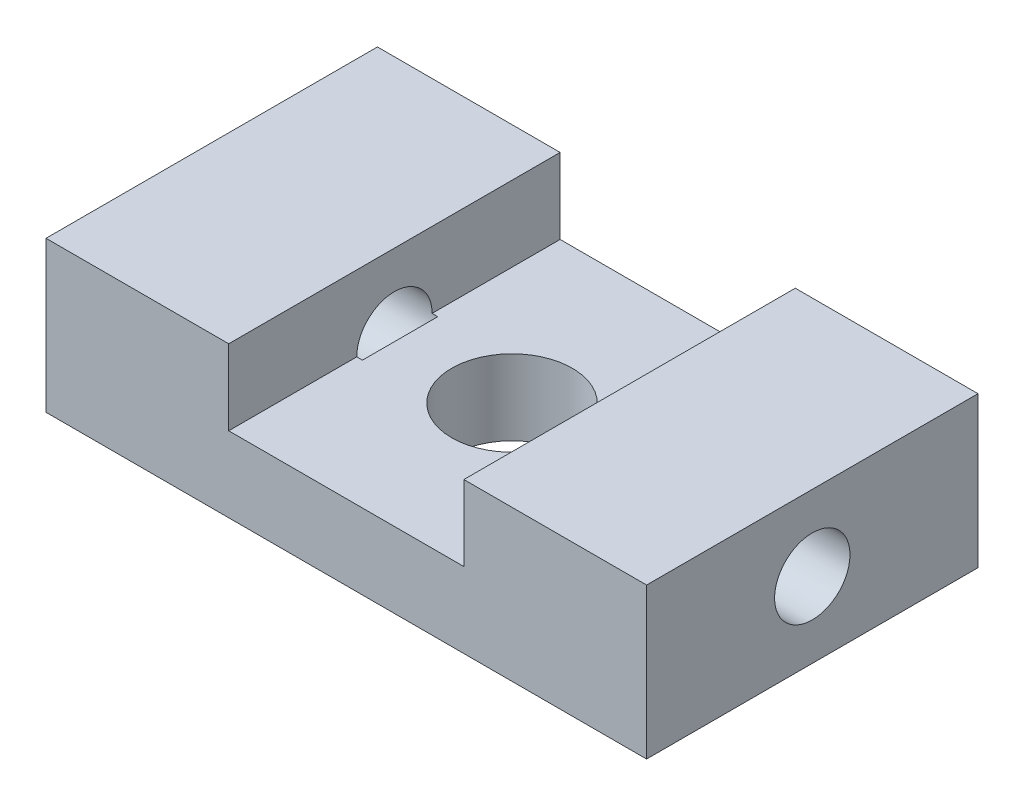
ISO-10303-21;
HEADER;
FILE_DESCRIPTION(('STEP AP214'),'2;1');
FILE_NAME('part.step','',(''),(''),'','','');
FILE_SCHEMA(('AUTOMOTIVE_DESIGN { 1 0 10303 214 1 1 1 1 }'));
ENDSEC;
DATA;
#1=APPLICATION_CONTEXT('core data for automotive mechanical design processes');
#2=APPLICATION_PROTOCOL_DEFINITION('international standard','automotive_design',2000,#1);
#3=PRODUCT_CONTEXT('',#1,'mechanical');
#4=PRODUCT('Part','Part','',(#3));
#5=PRODUCT_RELATED_PRODUCT_CATEGORY('part','',(#4));
#6=PRODUCT_DEFINITION_FORMATION('','',#4);
#7=PRODUCT_DEFINITION_CONTEXT('part definition',#1,'design');
#8=PRODUCT_DEFINITION('design','',#6,#7);
#9=PRODUCT_DEFINITION_SHAPE('','',#8);
#10=(LENGTH_UNIT() NAMED_UNIT(*) SI_UNIT(.MILLI.,.METRE.));
#11=(NAMED_UNIT(*) PLANE_ANGLE_UNIT() SI_UNIT($,.RADIAN.));
#12=(NAMED_UNIT(*) SI_UNIT($,.STERADIAN.) SOLID_ANGLE_UNIT());
#13=UNCERTAINTY_MEASURE_WITH_UNIT(LENGTH_MEASURE(1.E-05),#10,'distance_accuracy_value','');
#14=(GEOMETRIC_REPRESENTATION_CONTEXT(3) GLOBAL_UNCERTAINTY_ASSIGNED_CONTEXT((#13)) GLOBAL_UNIT_ASSIGNED_CONTEXT((#10,
#11,#12)) REPRESENTATION_CONTEXT('',''));
#15=CARTESIAN_POINT('',(0.,0.,0.));
#16=DIRECTION('',(0.,0.,1.));
#17=DIRECTION('',(1.,0.,0.));
#18=AXIS2_PLACEMENT_3D('',#15,#16,#17);
#19=CARTESIAN_POINT('',(39.8443423513475,20.,21.9869694383377));
#20=DIRECTION('',(0.,1.,0.));
#21=DIRECTION('',(0.,0.,1.));
#22=AXIS2_PLACEMENT_3D('',#19,#20,#21);
#23=PLANE('',#22);
#24=DIRECTION('',(0.,0.,-1.));
#25=VECTOR('',#24,1.);
#26=CARTESIAN_POINT('',(15.6,20.,-25.));
#27=LINE('',#26,#25);
#28=CARTESIAN_POINT('',(15.6,20.,21.9869694383377));
#29=VERTEX_POINT('',#28);
#30=CARTESIAN_POINT('',(15.6,20.,-21.9869694383377));
#31=VERTEX_POINT('',#30);
#32=EDGE_CURVE('E260',#29,#31,#27,.T.);
#33=ORIENTED_EDGE('',*,*,#32,.F.);
#34=DIRECTION('',(1.,0.,0.));
#35=VECTOR('',#34,1.);
#36=CARTESIAN_POINT('',(-39.8443423513475,20.,21.9869694383377));
#37=LINE('',#36,#35);
#38=CARTESIAN_POINT('',(39.8443423513475,20.,21.9869694383377));
#39=VERTEX_POINT('',#38);
#40=EDGE_CURVE('E141',#29,#39,#37,.T.);
#41=ORIENTED_EDGE('',*,*,#40,.T.);
#42=DIRECTION('',(0.,0.,-1.));
#43=VECTOR('',#42,1.);
#44=CARTESIAN_POINT('',(39.8443423513475,20.,-21.9869694383377));
#45=LINE('',#44,#43);
#46=CARTESIAN_POINT('',(39.8443423513475,20.,-21.9869694383377));
#47=VERTEX_POINT('',#46);
#48=EDGE_CURVE('E169',#39,#47,#45,.T.);
#49=ORIENTED_EDGE('',*,*,#48,.T.);
#50=DIRECTION('',(-1.,0.,0.));
#51=VECTOR('',#50,1.);
#52=CARTESIAN_POINT('',(-39.8443423513475,20.,-21.9869694383377));
#53=LINE('',#52,#51);
#54=EDGE_CURVE('E174',#47,#31,#53,.T.);
#55=ORIENTED_EDGE('',*,*,#54,.T.);
#56=EDGE_LOOP('',(#33,#41,#49,#55));
#57=FACE_BOUND('',#56,.T.);
#58=ADVANCED_FACE('F31',(#57),#23,.T.);
#59=CARTESIAN_POINT('',(0.,20.,0.));
#60=DIRECTION('',(0.,-1.,0.));
#61=DIRECTION('',(0.,0.,-1.));
#62=AXIS2_PLACEMENT_3D('',#59,#60,#61);
#63=CYLINDRICAL_SURFACE('',#62,8.);
#64=CARTESIAN_POINT('',(0.,0.,0.));
#65=DIRECTION('',(0.,1.,0.));
#66=DIRECTION('',(0.,0.,1.));
#67=AXIS2_PLACEMENT_3D('',#64,#65,#66);
#68=CIRCLE('',#67,8.);
#69=CARTESIAN_POINT('',(0.,0.,8.00000000000001));
#70=VERTEX_POINT('',#69);
#71=EDGE_CURVE('E163',#70,#70,#68,.T.);
#72=ORIENTED_EDGE('',*,*,#71,.F.);
#73=EDGE_LOOP('',(#72));
#74=FACE_BOUND('',#73,.T.);
#75=CARTESIAN_POINT('',(0.,10.,0.));
#76=DIRECTION('',(0.,1.,0.));
#77=DIRECTION('',(0.,0.,1.));
#78=AXIS2_PLACEMENT_3D('',#75,#76,#77);
#79=CIRCLE('',#78,8.);
#80=CARTESIAN_POINT('',(0.,10.,8.00000000000001));
#81=VERTEX_POINT('',#80);
#82=EDGE_CURVE('E128',#81,#81,#79,.T.);
#83=ORIENTED_EDGE('',*,*,#82,.T.);
#84=EDGE_LOOP('',(#83));
#85=FACE_BOUND('',#84,.T.);
#86=ADVANCED_FACE('F222',(#74,#85),#63,.F.);
#87=CARTESIAN_POINT('',(-14.8443423513475,10.,0.));
#88=DIRECTION('',(-1.,0.,0.));
#89=DIRECTION('',(0.,0.,1.));
#90=AXIS2_PLACEMENT_3D('',#87,#88,#89);
#91=CYLINDRICAL_SURFACE('',#90,5.);
#92=CARTESIAN_POINT('',(-39.8443423513475,10.,0.));
#93=DIRECTION('',(-1.,0.,0.));
#94=DIRECTION('',(0.,0.,1.));
#95=AXIS2_PLACEMENT_3D('',#92,#93,#94);
#96=CIRCLE('',#95,5.);
#97=CARTESIAN_POINT('',(-39.8443423513475,10.,5.));
#98=VERTEX_POINT('',#97);
#99=EDGE_CURVE('E157',#98,#98,#96,.T.);
#100=ORIENTED_EDGE('',*,*,#99,.T.);
#101=EDGE_LOOP('',(#100));
#102=FACE_BOUND('',#101,.T.);
#103=DIRECTION('',(-1.,0.,0.));
#104=VECTOR('',#103,1.);
#105=CARTESIAN_POINT('',(-14.8443423513475,10.,-5.));
#106=LINE('',#105,#104);
#107=CARTESIAN_POINT('',(-15.6,10.,-5.));
#108=VERTEX_POINT('',#107);
#109=CARTESIAN_POINT('',(-14.8443423513475,10.,-5.));
#110=VERTEX_POINT('',#109);
#111=EDGE_CURVE('E53',#108,#110,#106,.F.);
#112=ORIENTED_EDGE('',*,*,#111,.F.);
#113=CARTESIAN_POINT('',(-15.6,10.,0.));
#114=DIRECTION('',(-1.,0.,0.));
#115=DIRECTION('',(0.,0.,1.));
#116=AXIS2_PLACEMENT_3D('',#113,#114,#115);
#117=CIRCLE('',#116,5.);
#118=CARTESIAN_POINT('',(-15.6,10.,5.));
#119=VERTEX_POINT('',#118);
#120=EDGE_CURVE('E11',#108,#119,#117,.F.);
#121=ORIENTED_EDGE('',*,*,#120,.T.);
#122=DIRECTION('',(-1.,0.,0.));
#123=VECTOR('',#122,1.);
#124=CARTESIAN_POINT('',(-14.8443423513475,10.,5.));
#125=LINE('',#124,#123);
#126=CARTESIAN_POINT('',(-14.8443423513475,10.,5.));
#127=VERTEX_POINT('',#126);
#128=EDGE_CURVE('E211',#127,#119,#125,.T.);
#129=ORIENTED_EDGE('',*,*,#128,.F.);
#130=CARTESIAN_POINT('',(-14.8443423513475,10.,0.));
#131=DIRECTION('',(-1.,0.,0.));
#132=DIRECTION('',(0.,0.,1.));
#133=AXIS2_PLACEMENT_3D('',#130,#131,#132);
#134=CIRCLE('',#133,5.);
#135=EDGE_CURVE('E160',#110,#127,#134,.T.);
#136=ORIENTED_EDGE('',*,*,#135,.F.);
#137=EDGE_LOOP('',(#112,#121,#129,#136));
#138=FACE_BOUND('',#137,.T.);
#139=ADVANCED_FACE('F239',(#102,#138),#91,.F.);
#140=CARTESIAN_POINT('',(-14.8443423513475,10.,0.));
#141=DIRECTION('',(-1.,0.,0.));
#142=DIRECTION('',(0.,0.,1.));
#143=AXIS2_PLACEMENT_3D('',#140,#141,#142);
#144=PLANE('',#143);
#145=ORIENTED_EDGE('',*,*,#135,.T.);
#146=DIRECTION('',(0.,0.,-1.));
#147=VECTOR('',#146,1.);
#148=CARTESIAN_POINT('',(-14.8443423513475,10.,0.));
#149=LINE('',#148,#147);
#150=EDGE_CURVE('E209',#127,#110,#149,.T.);
#151=ORIENTED_EDGE('',*,*,#150,.T.);
#152=EDGE_LOOP('',(#145,#151));
#153=FACE_BOUND('',#152,.T.);
#154=ADVANCED_FACE('F276',(#153),#144,.T.);
#155=CARTESIAN_POINT('',(14.8443423513475,10.,0.));
#156=DIRECTION('',(1.,0.,0.));
#157=DIRECTION('',(0.,0.,-1.));
#158=AXIS2_PLACEMENT_3D('',#155,#156,#157);
#159=CYLINDRICAL_SURFACE('',#158,5.);
#160=CARTESIAN_POINT('',(39.8443423513475,10.,0.));
#161=DIRECTION('',(1.,0.,0.));
#162=DIRECTION('',(0.,0.,-1.));
#163=AXIS2_PLACEMENT_3D('',#160,#161,#162);
#164=CIRCLE('',#163,5.);
#165=CARTESIAN_POINT('',(39.8443423513475,10.,-5.));
#166=VERTEX_POINT('',#165);
#167=EDGE_CURVE('E153',#166,#166,#164,.T.);
#168=ORIENTED_EDGE('',*,*,#167,.T.);
#169=EDGE_LOOP('',(#168));
#170=FACE_BOUND('',#169,.T.);
#171=DIRECTION('',(1.,0.,0.));
#172=VECTOR('',#171,1.);
#173=CARTESIAN_POINT('',(14.8443423513475,10.,5.));
#174=LINE('',#173,#172);
#175=CARTESIAN_POINT('',(15.6,10.,5.));
#176=VERTEX_POINT('',#175);
#177=CARTESIAN_POINT('',(14.8443423513475,10.,5.));
#178=VERTEX_POINT('',#177);
#179=EDGE_CURVE('E208',#176,#178,#174,.F.);
#180=ORIENTED_EDGE('',*,*,#179,.F.);
#181=CARTESIAN_POINT('',(15.6,10.,0.));
#182=DIRECTION('',(1.,0.,0.));
#183=DIRECTION('',(0.,0.,-1.));
#184=AXIS2_PLACEMENT_3D('',#181,#182,#183);
#185=CIRCLE('',#184,5.);
#186=CARTESIAN_POINT('',(15.6,10.,-5.));
#187=VERTEX_POINT('',#186);
#188=EDGE_CURVE('E39',#176,#187,#185,.F.);
#189=ORIENTED_EDGE('',*,*,#188,.T.);
#190=DIRECTION('',(1.,0.,0.));
#191=VECTOR('',#190,1.);
#192=CARTESIAN_POINT('',(14.8443423513475,10.,-5.));
#193=LINE('',#192,#191);
#194=CARTESIAN_POINT('',(14.8443423513475,10.,-5.));
#195=VERTEX_POINT('',#194);
#196=EDGE_CURVE('E207',#195,#187,#193,.T.);
#197=ORIENTED_EDGE('',*,*,#196,.F.);
#198=CARTESIAN_POINT('',(14.8443423513475,10.,0.));
#199=DIRECTION('',(1.,0.,0.));
#200=DIRECTION('',(0.,0.,-1.));
#201=AXIS2_PLACEMENT_3D('',#198,#199,#200);
#202=CIRCLE('',#201,5.);
#203=EDGE_CURVE('E154',#178,#195,#202,.T.);
#204=ORIENTED_EDGE('',*,*,#203,.F.);
#205=EDGE_LOOP('',(#180,#189,#197,#204));
#206=FACE_BOUND('',#205,.T.);
#207=ADVANCED_FACE('F205',(#170,#206),#159,.F.);
#208=CARTESIAN_POINT('',(14.8443423513475,10.,0.));
#209=DIRECTION('',(1.,0.,0.));
#210=DIRECTION('',(0.,0.,-1.));
#211=AXIS2_PLACEMENT_3D('',#208,#209,#210);
#212=PLANE('',#211);
#213=ORIENTED_EDGE('',*,*,#203,.T.);
#214=DIRECTION('',(0.,0.,1.));
#215=VECTOR('',#214,1.);
#216=CARTESIAN_POINT('',(14.8443423513475,10.,0.));
#217=LINE('',#216,#215);
#218=EDGE_CURVE('E201',#195,#178,#217,.T.);
#219=ORIENTED_EDGE('',*,*,#218,.T.);
#220=EDGE_LOOP('',(#213,#219));
#221=FACE_BOUND('',#220,.T.);
#222=ADVANCED_FACE('F245',(#221),#212,.T.);
#223=DIRECTION('',(0.,0.,1.));
#224=VECTOR('',#223,1.);
#225=CARTESIAN_POINT('',(-15.6,20.,-25.));
#226=LINE('',#225,#224);
#227=CARTESIAN_POINT('',(-15.6,20.,-21.9869694383377));
#228=VERTEX_POINT('',#227);
#229=CARTESIAN_POINT('',(-15.6,20.,21.9869694383377));
#230=VERTEX_POINT('',#229);
#231=EDGE_CURVE('E255',#228,#230,#226,.T.);
#232=ORIENTED_EDGE('',*,*,#231,.F.);
#233=CARTESIAN_POINT('',(-39.8443423513475,20.,-21.9869694383377));
#234=VERTEX_POINT('',#233);
#235=EDGE_CURVE('E172',#228,#234,#53,.T.);
#236=ORIENTED_EDGE('',*,*,#235,.T.);
#237=DIRECTION('',(0.,0.,1.));
#238=VECTOR('',#237,1.);
#239=CARTESIAN_POINT('',(-39.8443423513475,20.,-21.9869694383377));
#240=LINE('',#239,#238);
#241=CARTESIAN_POINT('',(-39.8443423513475,20.,21.9869694383377));
#242=VERTEX_POINT('',#241);
#243=EDGE_CURVE('E177',#234,#242,#240,.T.);
#244=ORIENTED_EDGE('',*,*,#243,.T.);
#245=EDGE_CURVE('E179',#242,#230,#37,.T.);
#246=ORIENTED_EDGE('',*,*,#245,.T.);
#247=EDGE_LOOP('',(#232,#236,#244,#246));
#248=FACE_BOUND('',#247,.T.);
#249=ADVANCED_FACE('F235',(#248),#23,.T.);
#250=CARTESIAN_POINT('',(39.8443423513475,0.,21.9869694383377));
#251=DIRECTION('',(0.,1.,0.));
#252=DIRECTION('',(0.,0.,1.));
#253=AXIS2_PLACEMENT_3D('',#250,#251,#252);
#254=PLANE('',#253);
#255=DIRECTION('',(0.,0.,-1.));
#256=VECTOR('',#255,1.);
#257=CARTESIAN_POINT('',(39.8443423513475,0.,-21.9869694383377));
#258=LINE('',#257,#256);
#259=CARTESIAN_POINT('',(39.8443423513475,0.,21.9869694383377));
#260=VERTEX_POINT('',#259);
#261=CARTESIAN_POINT('',(39.8443423513475,0.,-21.9869694383377));
#262=VERTEX_POINT('',#261);
#263=EDGE_CURVE('E168',#260,#262,#258,.T.);
#264=ORIENTED_EDGE('',*,*,#263,.F.);
#265=DIRECTION('',(1.,0.,0.));
#266=VECTOR('',#265,1.);
#267=CARTESIAN_POINT('',(-39.8443423513475,0.,21.9869694383377));
#268=LINE('',#267,#266);
#269=CARTESIAN_POINT('',(-39.8443423513475,0.,21.9869694383377));
#270=VERTEX_POINT('',#269);
#271=EDGE_CURVE('E173',#270,#260,#268,.T.);
#272=ORIENTED_EDGE('',*,*,#271,.F.);
#273=DIRECTION('',(0.,0.,1.));
#274=VECTOR('',#273,1.);
#275=CARTESIAN_POINT('',(-39.8443423513475,0.,-21.9869694383377));
#276=LINE('',#275,#274);
#277=CARTESIAN_POINT('',(-39.8443423513475,0.,-21.9869694383377));
#278=VERTEX_POINT('',#277);
#279=EDGE_CURVE('E187',#278,#270,#276,.T.);
#280=ORIENTED_EDGE('',*,*,#279,.F.);
#281=DIRECTION('',(-1.,0.,0.));
#282=VECTOR('',#281,1.);
#283=CARTESIAN_POINT('',(-39.8443423513475,0.,-21.9869694383377));
#284=LINE('',#283,#282);
#285=EDGE_CURVE('E185',#262,#278,#284,.T.);
#286=ORIENTED_EDGE('',*,*,#285,.F.);
#287=EDGE_LOOP('',(#264,#272,#280,#286));
#288=FACE_BOUND('',#287,.T.);
#289=ORIENTED_EDGE('',*,*,#71,.T.);
#290=EDGE_LOOP('',(#289));
#291=FACE_BOUND('',#290,.T.);
#292=ADVANCED_FACE('F244',(#288,#291),#254,.F.);
#293=CARTESIAN_POINT('',(39.8443423513475,20.,-21.9869694383377));
#294=DIRECTION('',(-1.,0.,0.));
#295=DIRECTION('',(0.,0.,1.));
#296=AXIS2_PLACEMENT_3D('',#293,#294,#295);
#297=PLANE('',#296);
#298=ORIENTED_EDGE('',*,*,#167,.F.);
#299=EDGE_LOOP('',(#298));
#300=FACE_BOUND('',#299,.T.);
#301=ORIENTED_EDGE('',*,*,#263,.T.);
#302=DIRECTION('',(0.,-1.,0.));
#303=VECTOR('',#302,1.);
#304=CARTESIAN_POINT('',(39.8443423513475,20.,-21.9869694383377));
#305=LINE('',#304,#303);
#306=EDGE_CURVE('E198',#47,#262,#305,.T.);
#307=ORIENTED_EDGE('',*,*,#306,.F.);
#308=ORIENTED_EDGE('',*,*,#48,.F.);
#309=DIRECTION('',(0.,-1.,0.));
#310=VECTOR('',#309,1.);
#311=CARTESIAN_POINT('',(39.8443423513475,20.,21.9869694383377));
#312=LINE('',#311,#310);
#313=EDGE_CURVE('E182',#39,#260,#312,.T.);
#314=ORIENTED_EDGE('',*,*,#313,.T.);
#315=EDGE_LOOP('',(#301,#307,#308,#314));
#316=FACE_BOUND('',#315,.T.);
#317=ADVANCED_FACE('F33',(#300,#316),#297,.F.);
#318=CARTESIAN_POINT('',(-39.8443423513475,20.,-21.9869694383377));
#319=DIRECTION('',(0.,0.,1.));
#320=DIRECTION('',(1.,0.,0.));
#321=AXIS2_PLACEMENT_3D('',#318,#319,#320);
#322=PLANE('',#321);
#323=DIRECTION('',(-1.,0.,0.));
#324=VECTOR('',#323,1.);
#325=CARTESIAN_POINT('',(-39.8443423513475,10.,-21.9869694383377));
#326=LINE('',#325,#324);
#327=CARTESIAN_POINT('',(15.6,10.,-21.9869694383377));
#328=VERTEX_POINT('',#327);
#329=CARTESIAN_POINT('',(-15.6,10.,-21.9869694383377));
#330=VERTEX_POINT('',#329);
#331=EDGE_CURVE('E127',#328,#330,#326,.T.);
#332=ORIENTED_EDGE('',*,*,#331,.F.);
#333=DIRECTION('',(0.,1.,0.));
#334=VECTOR('',#333,1.);
#335=CARTESIAN_POINT('',(15.6,20.,-21.9869694383377));
#336=LINE('',#335,#334);
#337=EDGE_CURVE('E142',#328,#31,#336,.T.);
#338=ORIENTED_EDGE('',*,*,#337,.T.);
#339=ORIENTED_EDGE('',*,*,#54,.F.);
#340=ORIENTED_EDGE('',*,*,#306,.T.);
#341=ORIENTED_EDGE('',*,*,#285,.T.);
#342=DIRECTION('',(0.,-1.,0.));
#343=VECTOR('',#342,1.);
#344=CARTESIAN_POINT('',(-39.8443423513475,20.,-21.9869694383377));
#345=LINE('',#344,#343);
#346=EDGE_CURVE('E195',#234,#278,#345,.T.);
#347=ORIENTED_EDGE('',*,*,#346,.F.);
#348=ORIENTED_EDGE('',*,*,#235,.F.);
#349=DIRECTION('',(0.,-1.,0.));
#350=VECTOR('',#349,1.);
#351=CARTESIAN_POINT('',(-15.6,20.,-21.9869694383377));
#352=LINE('',#351,#350);
#353=EDGE_CURVE('E150',#228,#330,#352,.T.);
#354=ORIENTED_EDGE('',*,*,#353,.T.);
#355=EDGE_LOOP('',(#332,#338,#339,#340,#341,#347,#348,#354));
#356=FACE_BOUND('',#355,.T.);
#357=ADVANCED_FACE('F263',(#356),#322,.F.);
#358=CARTESIAN_POINT('',(-39.8443423513475,20.,-21.9869694383377));
#359=DIRECTION('',(1.,0.,0.));
#360=DIRECTION('',(0.,0.,-1.));
#361=AXIS2_PLACEMENT_3D('',#358,#359,#360);
#362=PLANE('',#361);
#363=ORIENTED_EDGE('',*,*,#99,.F.);
#364=EDGE_LOOP('',(#363));
#365=FACE_BOUND('',#364,.T.);
#366=ORIENTED_EDGE('',*,*,#279,.T.);
#367=DIRECTION('',(0.,-1.,0.));
#368=VECTOR('',#367,1.);
#369=CARTESIAN_POINT('',(-39.8443423513475,20.,21.9869694383377));
#370=LINE('',#369,#368);
#371=EDGE_CURVE('E192',#242,#270,#370,.T.);
#372=ORIENTED_EDGE('',*,*,#371,.F.);
#373=ORIENTED_EDGE('',*,*,#243,.F.);
#374=ORIENTED_EDGE('',*,*,#346,.T.);
#375=EDGE_LOOP('',(#366,#372,#373,#374));
#376=FACE_BOUND('',#375,.T.);
#377=ADVANCED_FACE('F268',(#365,#376),#362,.F.);
#378=CARTESIAN_POINT('',(-39.8443423513475,20.,21.9869694383377));
#379=DIRECTION('',(0.,0.,-1.));
#380=DIRECTION('',(-1.,0.,0.));
#381=AXIS2_PLACEMENT_3D('',#378,#379,#380);
#382=PLANE('',#381);
#383=ORIENTED_EDGE('',*,*,#40,.F.);
#384=DIRECTION('',(0.,-1.,0.));
#385=VECTOR('',#384,1.);
#386=CARTESIAN_POINT('',(15.6,20.,21.9869694383377));
#387=LINE('',#386,#385);
#388=CARTESIAN_POINT('',(15.6,10.,21.9869694383377));
#389=VERTEX_POINT('',#388);
#390=EDGE_CURVE('E133',#29,#389,#387,.T.);
#391=ORIENTED_EDGE('',*,*,#390,.T.);
#392=DIRECTION('',(1.,0.,0.));
#393=VECTOR('',#392,1.);
#394=CARTESIAN_POINT('',(-39.8443423513475,10.,21.9869694383377));
#395=LINE('',#394,#393);
#396=CARTESIAN_POINT('',(-15.6,10.,21.9869694383377));
#397=VERTEX_POINT('',#396);
#398=EDGE_CURVE('E119',#397,#389,#395,.T.);
#399=ORIENTED_EDGE('',*,*,#398,.F.);
#400=DIRECTION('',(0.,1.,0.));
#401=VECTOR('',#400,1.);
#402=CARTESIAN_POINT('',(-15.6,20.,21.9869694383377));
#403=LINE('',#402,#401);
#404=EDGE_CURVE('E145',#397,#230,#403,.T.);
#405=ORIENTED_EDGE('',*,*,#404,.T.);
#406=ORIENTED_EDGE('',*,*,#245,.F.);
#407=ORIENTED_EDGE('',*,*,#371,.T.);
#408=ORIENTED_EDGE('',*,*,#271,.T.);
#409=ORIENTED_EDGE('',*,*,#313,.F.);
#410=EDGE_LOOP('',(#383,#391,#399,#405,#406,#407,#408,#409));
#411=FACE_BOUND('',#410,.T.);
#412=ADVANCED_FACE('F139',(#411),#382,.F.);
#413=CARTESIAN_POINT('',(-15.6,10.,-25.));
#414=DIRECTION('',(-1.,0.,0.));
#415=DIRECTION('',(0.,0.,1.));
#416=AXIS2_PLACEMENT_3D('',#413,#414,#415);
#417=PLANE('',#416);
#418=ORIENTED_EDGE('',*,*,#231,.T.);
#419=ORIENTED_EDGE('',*,*,#404,.F.);
#420=DIRECTION('',(0.,0.,1.));
#421=VECTOR('',#420,1.);
#422=CARTESIAN_POINT('',(-15.6,10.,-25.));
#423=LINE('',#422,#421);
#424=EDGE_CURVE('E46',#119,#397,#423,.T.);
#425=ORIENTED_EDGE('',*,*,#424,.F.);
#426=ORIENTED_EDGE('',*,*,#120,.F.);
#427=EDGE_CURVE('E213',#330,#108,#423,.T.);
#428=ORIENTED_EDGE('',*,*,#427,.F.);
#429=ORIENTED_EDGE('',*,*,#353,.F.);
#430=EDGE_LOOP('',(#418,#419,#425,#426,#428,#429));
#431=FACE_BOUND('',#430,.T.);
#432=ADVANCED_FACE('F229',(#431),#417,.F.);
#433=CARTESIAN_POINT('',(15.6,10.,-25.));
#434=DIRECTION('',(1.,0.,0.));
#435=DIRECTION('',(0.,0.,-1.));
#436=AXIS2_PLACEMENT_3D('',#433,#434,#435);
#437=PLANE('',#436);
#438=DIRECTION('',(0.,0.,-1.));
#439=VECTOR('',#438,1.);
#440=CARTESIAN_POINT('',(15.6,10.,-25.));
#441=LINE('',#440,#439);
#442=EDGE_CURVE('E136',#187,#328,#441,.T.);
#443=ORIENTED_EDGE('',*,*,#442,.F.);
#444=ORIENTED_EDGE('',*,*,#188,.F.);
#445=EDGE_CURVE('E122',#389,#176,#441,.T.);
#446=ORIENTED_EDGE('',*,*,#445,.F.);
#447=ORIENTED_EDGE('',*,*,#390,.F.);
#448=ORIENTED_EDGE('',*,*,#32,.T.);
#449=ORIENTED_EDGE('',*,*,#337,.F.);
#450=EDGE_LOOP('',(#443,#444,#446,#447,#448,#449));
#451=FACE_BOUND('',#450,.T.);
#452=ADVANCED_FACE('F132',(#451),#437,.F.);
#453=CARTESIAN_POINT('',(15.6,10.,25.));
#454=DIRECTION('',(0.,1.,0.));
#455=DIRECTION('',(0.,0.,1.));
#456=AXIS2_PLACEMENT_3D('',#453,#454,#455);
#457=PLANE('',#456);
#458=ORIENTED_EDGE('',*,*,#82,.F.);
#459=EDGE_LOOP('',(#458));
#460=FACE_BOUND('',#459,.T.);
#461=ORIENTED_EDGE('',*,*,#331,.T.);
#462=ORIENTED_EDGE('',*,*,#427,.T.);
#463=ORIENTED_EDGE('',*,*,#111,.T.);
#464=ORIENTED_EDGE('',*,*,#150,.F.);
#465=ORIENTED_EDGE('',*,*,#128,.T.);
#466=ORIENTED_EDGE('',*,*,#424,.T.);
#467=ORIENTED_EDGE('',*,*,#398,.T.);
#468=ORIENTED_EDGE('',*,*,#445,.T.);
#469=ORIENTED_EDGE('',*,*,#179,.T.);
#470=ORIENTED_EDGE('',*,*,#218,.F.);
#471=ORIENTED_EDGE('',*,*,#196,.T.);
#472=ORIENTED_EDGE('',*,*,#442,.T.);
#473=EDGE_LOOP('',(#461,#462,#463,#464,#465,#466,#467,#468,#469,#470,#471,#472));
#474=FACE_BOUND('',#473,.T.);
#475=ADVANCED_FACE('F121',(#460,#474),#457,.T.);
#476=CLOSED_SHELL('',(#58,#86,#139,#154,#207,#222,#249,#292,#317,#357,#377,#412,#432,#452,#475));
#477=MANIFOLD_SOLID_BREP('B2',#476);
#478=ADVANCED_BREP_SHAPE_REPRESENTATION('',(#18,#477),#14);
#479=SHAPE_DEFINITION_REPRESENTATION(#9,#478);
ENDSEC;
END-ISO-10303-21;
